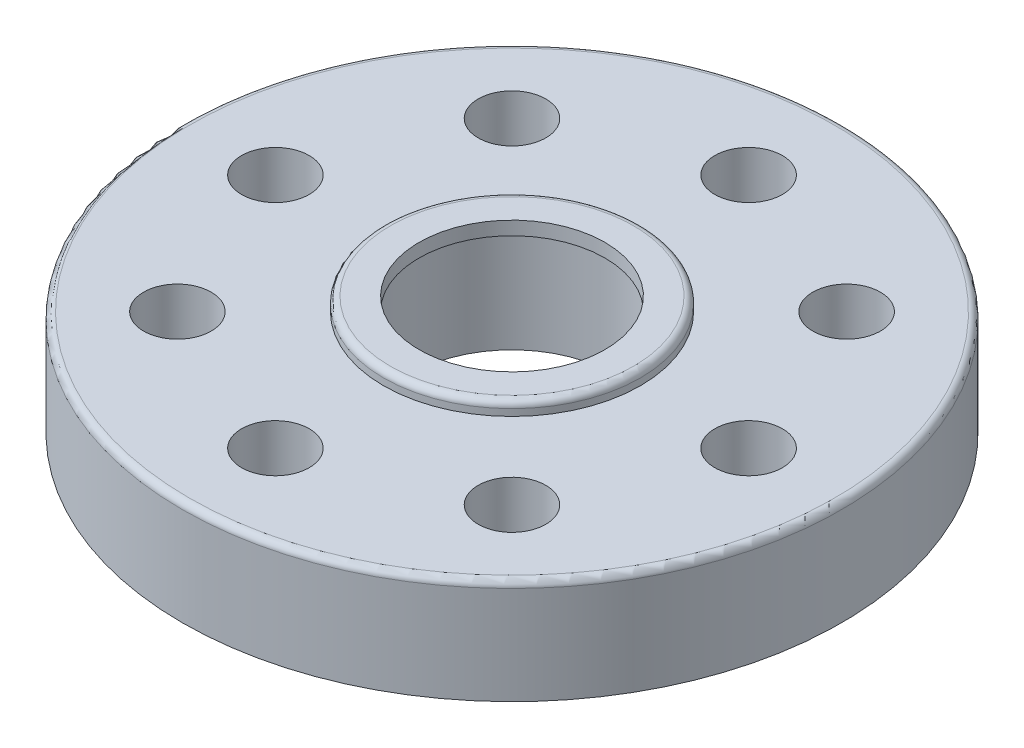
ISO-10303-21;
HEADER;
FILE_DESCRIPTION(('STEP AP214'),'2;1');
FILE_NAME('part.step','',(''),(''),'','','');
FILE_SCHEMA(('AUTOMOTIVE_DESIGN { 1 0 10303 214 1 1 1 1 }'));
ENDSEC;
DATA;
#1=APPLICATION_CONTEXT('core data for automotive mechanical design processes');
#2=APPLICATION_PROTOCOL_DEFINITION('international standard','automotive_design',2000,#1);
#3=PRODUCT_CONTEXT('',#1,'mechanical');
#4=PRODUCT('Part','Part','',(#3));
#5=PRODUCT_RELATED_PRODUCT_CATEGORY('part','',(#4));
#6=PRODUCT_DEFINITION_FORMATION('','',#4);
#7=PRODUCT_DEFINITION_CONTEXT('part definition',#1,'design');
#8=PRODUCT_DEFINITION('design','',#6,#7);
#9=PRODUCT_DEFINITION_SHAPE('','',#8);
#10=(LENGTH_UNIT() NAMED_UNIT(*) SI_UNIT(.MILLI.,.METRE.));
#11=(NAMED_UNIT(*) PLANE_ANGLE_UNIT() SI_UNIT($,.RADIAN.));
#12=(NAMED_UNIT(*) SI_UNIT($,.STERADIAN.) SOLID_ANGLE_UNIT());
#13=UNCERTAINTY_MEASURE_WITH_UNIT(LENGTH_MEASURE(1.E-05),#10,'distance_accuracy_value','');
#14=(GEOMETRIC_REPRESENTATION_CONTEXT(3) GLOBAL_UNCERTAINTY_ASSIGNED_CONTEXT((#13)) GLOBAL_UNIT_ASSIGNED_CONTEXT((#10,
#11,#12)) REPRESENTATION_CONTEXT('',''));
#15=CARTESIAN_POINT('',(0.,0.,0.));
#16=DIRECTION('',(0.,0.,1.));
#17=DIRECTION('',(1.,0.,0.));
#18=AXIS2_PLACEMENT_3D('',#15,#16,#17);
#19=CARTESIAN_POINT('',(0.,3.5,0.));
#20=DIRECTION('',(0.,1.,0.));
#21=DIRECTION('',(0.,0.,1.));
#22=AXIS2_PLACEMENT_3D('',#19,#20,#21);
#23=PLANE('',#22);
#24=CARTESIAN_POINT('',(0.,3.5,0.));
#25=DIRECTION('',(0.,-1.,0.));
#26=DIRECTION('',(0.,0.,-1.));
#27=AXIS2_PLACEMENT_3D('',#24,#25,#26);
#28=CIRCLE('',#27,2.75);
#29=CARTESIAN_POINT('',(0.,3.5,-2.75));
#30=VERTEX_POINT('',#29);
#31=EDGE_CURVE('E18',#30,#30,#28,.T.);
#32=ORIENTED_EDGE('',*,*,#31,.T.);
#33=EDGE_LOOP('',(#32));
#34=FACE_BOUND('',#33,.T.);
#35=CARTESIAN_POINT('',(0.,3.5,0.));
#36=DIRECTION('',(0.,-1.,0.));
#37=DIRECTION('',(0.,0.,1.));
#38=AXIS2_PLACEMENT_3D('',#35,#36,#37);
#39=CIRCLE('',#38,3.6);
#40=CARTESIAN_POINT('',(0.,3.5,3.6));
#41=VERTEX_POINT('',#40);
#42=EDGE_CURVE('E99',#41,#41,#39,.T.);
#43=ORIENTED_EDGE('',*,*,#42,.F.);
#44=EDGE_LOOP('',(#43));
#45=FACE_BOUND('',#44,.T.);
#46=ADVANCED_FACE('F14',(#34,#45),#23,.T.);
#47=CARTESIAN_POINT('',(0.,3.3,0.));
#48=DIRECTION('',(0.,1.,0.));
#49=DIRECTION('',(0.,0.,1.));
#50=AXIS2_PLACEMENT_3D('',#47,#48,#49);
#51=TOROIDAL_SURFACE('',#50,3.6,0.2);
#52=ORIENTED_EDGE('',*,*,#42,.T.);
#53=EDGE_LOOP('',(#52));
#54=FACE_BOUND('',#53,.T.);
#55=CARTESIAN_POINT('',(0.,3.3,0.));
#56=DIRECTION('',(0.,-1.,0.));
#57=DIRECTION('',(0.,0.,-1.));
#58=AXIS2_PLACEMENT_3D('',#55,#56,#57);
#59=CIRCLE('',#58,3.8);
#60=CARTESIAN_POINT('',(0.,3.3,-3.8));
#61=VERTEX_POINT('',#60);
#62=EDGE_CURVE('E90',#61,#61,#59,.T.);
#63=ORIENTED_EDGE('',*,*,#62,.F.);
#64=EDGE_LOOP('',(#63));
#65=FACE_BOUND('',#64,.T.);
#66=ADVANCED_FACE('F133',(#54,#65),#51,.T.);
#67=CARTESIAN_POINT('',(0.,3.5,0.));
#68=DIRECTION('',(0.,-1.,0.));
#69=DIRECTION('',(0.,0.,-1.));
#70=AXIS2_PLACEMENT_3D('',#67,#68,#69);
#71=CYLINDRICAL_SURFACE('',#70,2.75);
#72=CARTESIAN_POINT('',(0.,3.1,0.));
#73=DIRECTION('',(0.,-1.,0.));
#74=DIRECTION('',(0.,0.,-1.));
#75=AXIS2_PLACEMENT_3D('',#72,#73,#74);
#76=CIRCLE('',#75,2.75);
#77=CARTESIAN_POINT('',(0.,3.1,-2.75));
#78=VERTEX_POINT('',#77);
#79=EDGE_CURVE('E88',#78,#78,#76,.T.);
#80=ORIENTED_EDGE('',*,*,#79,.T.);
#81=EDGE_LOOP('',(#80));
#82=FACE_BOUND('',#81,.T.);
#83=ORIENTED_EDGE('',*,*,#31,.F.);
#84=EDGE_LOOP('',(#83));
#85=FACE_BOUND('',#84,.T.);
#86=ADVANCED_FACE('F130',(#82,#85),#71,.F.);
#87=CARTESIAN_POINT('',(0.,3.5,0.));
#88=DIRECTION('',(0.,-1.,0.));
#89=DIRECTION('',(0.,0.,-1.));
#90=AXIS2_PLACEMENT_3D('',#87,#88,#89);
#91=CYLINDRICAL_SURFACE('',#90,3.8);
#92=CARTESIAN_POINT('',(0.,3.1,0.));
#93=DIRECTION('',(0.,-1.,0.));
#94=DIRECTION('',(0.,0.,-1.));
#95=AXIS2_PLACEMENT_3D('',#92,#93,#94);
#96=CIRCLE('',#95,3.8);
#97=CARTESIAN_POINT('',(0.,3.1,-3.8));
#98=VERTEX_POINT('',#97);
#99=EDGE_CURVE('E85',#98,#98,#96,.T.);
#100=ORIENTED_EDGE('',*,*,#99,.F.);
#101=EDGE_LOOP('',(#100));
#102=FACE_BOUND('',#101,.T.);
#103=ORIENTED_EDGE('',*,*,#62,.T.);
#104=EDGE_LOOP('',(#103));
#105=FACE_BOUND('',#104,.T.);
#106=ADVANCED_FACE('F126',(#102,#105),#91,.T.);
#107=CARTESIAN_POINT('',(0.,2.9,0.));
#108=DIRECTION('',(0.,1.,0.));
#109=DIRECTION('',(0.,0.,1.));
#110=AXIS2_PLACEMENT_3D('',#107,#108,#109);
#111=TOROIDAL_SURFACE('',#110,9.55,0.2);
#112=CARTESIAN_POINT('',(0.,3.1,0.));
#113=DIRECTION('',(0.,-1.,0.));
#114=DIRECTION('',(0.,0.,1.));
#115=AXIS2_PLACEMENT_3D('',#112,#113,#114);
#116=CIRCLE('',#115,9.55);
#117=CARTESIAN_POINT('',(0.,3.1,9.55));
#118=VERTEX_POINT('',#117);
#119=EDGE_CURVE('E87',#118,#118,#116,.F.);
#120=ORIENTED_EDGE('',*,*,#119,.F.);
#121=EDGE_LOOP('',(#120));
#122=FACE_BOUND('',#121,.T.);
#123=CARTESIAN_POINT('',(0.,2.9,0.));
#124=DIRECTION('',(0.,-1.,0.));
#125=DIRECTION('',(0.,0.,-1.));
#126=AXIS2_PLACEMENT_3D('',#123,#124,#125);
#127=CIRCLE('',#126,9.75);
#128=CARTESIAN_POINT('',(0.,2.9,-9.75));
#129=VERTEX_POINT('',#128);
#130=EDGE_CURVE('E72',#129,#129,#127,.T.);
#131=ORIENTED_EDGE('',*,*,#130,.F.);
#132=EDGE_LOOP('',(#131));
#133=FACE_BOUND('',#132,.T.);
#134=ADVANCED_FACE('F115',(#122,#133),#111,.T.);
#135=CARTESIAN_POINT('',(0.,3.1,0.));
#136=DIRECTION('',(0.,1.,0.));
#137=DIRECTION('',(0.,0.,1.));
#138=AXIS2_PLACEMENT_3D('',#135,#136,#137);
#139=PLANE('',#138);
#140=ORIENTED_EDGE('',*,*,#79,.F.);
#141=EDGE_LOOP('',(#140));
#142=FACE_BOUND('',#141,.T.);
#143=CARTESIAN_POINT('',(0.,3.1,0.));
#144=DIRECTION('',(0.,-1.,0.));
#145=DIRECTION('',(0.,0.,-1.));
#146=AXIS2_PLACEMENT_3D('',#143,#144,#145);
#147=CIRCLE('',#146,3.);
#148=CARTESIAN_POINT('',(0.,3.1,-3.));
#149=VERTEX_POINT('',#148);
#150=EDGE_CURVE('E69',#149,#149,#147,.T.);
#151=ORIENTED_EDGE('',*,*,#150,.T.);
#152=EDGE_LOOP('',(#151));
#153=FACE_BOUND('',#152,.T.);
#154=ADVANCED_FACE('F125',(#142,#153),#139,.F.);
#155=CARTESIAN_POINT('',(0.,3.1,0.));
#156=DIRECTION('',(0.,1.,0.));
#157=DIRECTION('',(0.,0.,1.));
#158=AXIS2_PLACEMENT_3D('',#155,#156,#157);
#159=PLANE('',#158);
#160=ORIENTED_EDGE('',*,*,#99,.T.);
#161=EDGE_LOOP('',(#160));
#162=FACE_BOUND('',#161,.T.);
#163=CARTESIAN_POINT('',(0.,3.1,-7.));
#164=DIRECTION('',(0.,-1.,0.));
#165=DIRECTION('',(0.,0.,-1.));
#166=AXIS2_PLACEMENT_3D('',#163,#164,#165);
#167=CIRCLE('',#166,1.);
#168=CARTESIAN_POINT('',(0.,3.1,-8.));
#169=VERTEX_POINT('',#168);
#170=EDGE_CURVE('E82',#169,#169,#167,.T.);
#171=ORIENTED_EDGE('',*,*,#170,.T.);
#172=EDGE_LOOP('',(#171));
#173=FACE_BOUND('',#172,.T.);
#174=CARTESIAN_POINT('',(-7.,3.1,0.));
#175=DIRECTION('',(0.,-1.,0.));
#176=DIRECTION('',(0.,0.,-1.));
#177=AXIS2_PLACEMENT_3D('',#174,#175,#176);
#178=CIRCLE('',#177,1.);
#179=CARTESIAN_POINT('',(-7.,3.1,-1.00000000000005));
#180=VERTEX_POINT('',#179);
#181=EDGE_CURVE('E79',#180,#180,#178,.T.);
#182=ORIENTED_EDGE('',*,*,#181,.T.);
#183=EDGE_LOOP('',(#182));
#184=FACE_BOUND('',#183,.T.);
#185=CARTESIAN_POINT('',(0.,3.1,7.));
#186=DIRECTION('',(0.,-1.,0.));
#187=DIRECTION('',(0.,0.,-1.));
#188=AXIS2_PLACEMENT_3D('',#185,#186,#187);
#189=CIRCLE('',#188,1.);
#190=CARTESIAN_POINT('',(0.,3.1,6.));
#191=VERTEX_POINT('',#190);
#192=EDGE_CURVE('E76',#191,#191,#189,.T.);
#193=ORIENTED_EDGE('',*,*,#192,.T.);
#194=EDGE_LOOP('',(#193));
#195=FACE_BOUND('',#194,.T.);
#196=CARTESIAN_POINT('',(7.,3.1,0.));
#197=DIRECTION('',(0.,-1.,0.));
#198=DIRECTION('',(0.,0.,-1.));
#199=AXIS2_PLACEMENT_3D('',#196,#197,#198);
#200=CIRCLE('',#199,1.);
#201=CARTESIAN_POINT('',(7.,3.1,-1.));
#202=VERTEX_POINT('',#201);
#203=EDGE_CURVE('E73',#202,#202,#200,.T.);
#204=ORIENTED_EDGE('',*,*,#203,.T.);
#205=EDGE_LOOP('',(#204));
#206=FACE_BOUND('',#205,.T.);
#207=CARTESIAN_POINT('',(4.94974746830582,3.1,4.94974746830584));
#208=DIRECTION('',(0.,-1.,0.));
#209=DIRECTION('',(0.,0.,-1.));
#210=AXIS2_PLACEMENT_3D('',#207,#208,#209);
#211=CIRCLE('',#210,1.);
#212=CARTESIAN_POINT('',(4.94974746830582,3.1,3.94974746830584));
#213=VERTEX_POINT('',#212);
#214=EDGE_CURVE('E66',#213,#213,#211,.T.);
#215=ORIENTED_EDGE('',*,*,#214,.T.);
#216=EDGE_LOOP('',(#215));
#217=FACE_BOUND('',#216,.T.);
#218=CARTESIAN_POINT('',(-4.94974746830586,3.1,4.94974746830581));
#219=DIRECTION('',(0.,-1.,0.));
#220=DIRECTION('',(0.,0.,-1.));
#221=AXIS2_PLACEMENT_3D('',#218,#219,#220);
#222=CIRCLE('',#221,1.);
#223=CARTESIAN_POINT('',(-4.94974746830586,3.1,3.9497474683058));
#224=VERTEX_POINT('',#223);
#225=EDGE_CURVE('E63',#224,#224,#222,.T.);
#226=ORIENTED_EDGE('',*,*,#225,.T.);
#227=EDGE_LOOP('',(#226));
#228=FACE_BOUND('',#227,.T.);
#229=CARTESIAN_POINT('',(-4.94974746830579,3.1,-4.94974746830588));
#230=DIRECTION('',(0.,-1.,0.));
#231=DIRECTION('',(0.,0.,-1.));
#232=AXIS2_PLACEMENT_3D('',#229,#230,#231);
#233=CIRCLE('',#232,1.);
#234=CARTESIAN_POINT('',(-4.94974746830579,3.1,-5.94974746830588));
#235=VERTEX_POINT('',#234);
#236=EDGE_CURVE('E60',#235,#235,#233,.T.);
#237=ORIENTED_EDGE('',*,*,#236,.T.);
#238=EDGE_LOOP('',(#237));
#239=FACE_BOUND('',#238,.T.);
#240=CARTESIAN_POINT('',(4.94974746830589,3.1,-4.94974746830577));
#241=DIRECTION('',(0.,-1.,0.));
#242=DIRECTION('',(0.,0.,-1.));
#243=AXIS2_PLACEMENT_3D('',#240,#241,#242);
#244=CIRCLE('',#243,1.);
#245=CARTESIAN_POINT('',(4.94974746830589,3.1,-5.94974746830577));
#246=VERTEX_POINT('',#245);
#247=EDGE_CURVE('E57',#246,#246,#244,.T.);
#248=ORIENTED_EDGE('',*,*,#247,.T.);
#249=EDGE_LOOP('',(#248));
#250=FACE_BOUND('',#249,.T.);
#251=ORIENTED_EDGE('',*,*,#119,.T.);
#252=EDGE_LOOP('',(#251));
#253=FACE_BOUND('',#252,.T.);
#254=ADVANCED_FACE('F190',(#162,#173,#184,#195,#206,#217,#228,#239,#250,#253),#159,.T.);
#255=CARTESIAN_POINT('',(0.,3.1,-7.));
#256=DIRECTION('',(0.,-1.,0.));
#257=DIRECTION('',(0.,0.,-1.));
#258=AXIS2_PLACEMENT_3D('',#255,#256,#257);
#259=CYLINDRICAL_SURFACE('',#258,1.);
#260=CARTESIAN_POINT('',(0.,0.,-7.));
#261=DIRECTION('',(0.,-1.,0.));
#262=DIRECTION('',(0.,0.,-1.));
#263=AXIS2_PLACEMENT_3D('',#260,#261,#262);
#264=CIRCLE('',#263,1.);
#265=CARTESIAN_POINT('',(0.,0.,-8.));
#266=VERTEX_POINT('',#265);
#267=EDGE_CURVE('E54',#266,#266,#264,.T.);
#268=ORIENTED_EDGE('',*,*,#267,.T.);
#269=EDGE_LOOP('',(#268));
#270=FACE_BOUND('',#269,.T.);
#271=ORIENTED_EDGE('',*,*,#170,.F.);
#272=EDGE_LOOP('',(#271));
#273=FACE_BOUND('',#272,.T.);
#274=ADVANCED_FACE('F187',(#270,#273),#259,.F.);
#275=CARTESIAN_POINT('',(-7.,3.1,0.));
#276=DIRECTION('',(0.,-1.,0.));
#277=DIRECTION('',(0.,0.,-1.));
#278=AXIS2_PLACEMENT_3D('',#275,#276,#277);
#279=CYLINDRICAL_SURFACE('',#278,1.);
#280=CARTESIAN_POINT('',(-7.,0.,0.));
#281=DIRECTION('',(0.,-1.,0.));
#282=DIRECTION('',(0.,0.,-1.));
#283=AXIS2_PLACEMENT_3D('',#280,#281,#282);
#284=CIRCLE('',#283,1.);
#285=CARTESIAN_POINT('',(-7.,0.,-1.00000000000005));
#286=VERTEX_POINT('',#285);
#287=EDGE_CURVE('E51',#286,#286,#284,.T.);
#288=ORIENTED_EDGE('',*,*,#287,.T.);
#289=EDGE_LOOP('',(#288));
#290=FACE_BOUND('',#289,.T.);
#291=ORIENTED_EDGE('',*,*,#181,.F.);
#292=EDGE_LOOP('',(#291));
#293=FACE_BOUND('',#292,.T.);
#294=ADVANCED_FACE('F183',(#290,#293),#279,.F.);
#295=CARTESIAN_POINT('',(0.,3.1,7.));
#296=DIRECTION('',(0.,-1.,0.));
#297=DIRECTION('',(0.,0.,-1.));
#298=AXIS2_PLACEMENT_3D('',#295,#296,#297);
#299=CYLINDRICAL_SURFACE('',#298,1.);
#300=CARTESIAN_POINT('',(0.,0.,7.));
#301=DIRECTION('',(0.,-1.,0.));
#302=DIRECTION('',(0.,0.,-1.));
#303=AXIS2_PLACEMENT_3D('',#300,#301,#302);
#304=CIRCLE('',#303,1.);
#305=CARTESIAN_POINT('',(0.,0.,6.));
#306=VERTEX_POINT('',#305);
#307=EDGE_CURVE('E48',#306,#306,#304,.T.);
#308=ORIENTED_EDGE('',*,*,#307,.T.);
#309=EDGE_LOOP('',(#308));
#310=FACE_BOUND('',#309,.T.);
#311=ORIENTED_EDGE('',*,*,#192,.F.);
#312=EDGE_LOOP('',(#311));
#313=FACE_BOUND('',#312,.T.);
#314=ADVANCED_FACE('F179',(#310,#313),#299,.F.);
#315=CARTESIAN_POINT('',(7.,3.1,0.));
#316=DIRECTION('',(0.,-1.,0.));
#317=DIRECTION('',(0.,0.,-1.));
#318=AXIS2_PLACEMENT_3D('',#315,#316,#317);
#319=CYLINDRICAL_SURFACE('',#318,1.);
#320=CARTESIAN_POINT('',(7.,0.,0.));
#321=DIRECTION('',(0.,-1.,0.));
#322=DIRECTION('',(0.,0.,-1.));
#323=AXIS2_PLACEMENT_3D('',#320,#321,#322);
#324=CIRCLE('',#323,1.);
#325=CARTESIAN_POINT('',(7.,0.,-1.));
#326=VERTEX_POINT('',#325);
#327=EDGE_CURVE('E45',#326,#326,#324,.T.);
#328=ORIENTED_EDGE('',*,*,#327,.T.);
#329=EDGE_LOOP('',(#328));
#330=FACE_BOUND('',#329,.T.);
#331=ORIENTED_EDGE('',*,*,#203,.F.);
#332=EDGE_LOOP('',(#331));
#333=FACE_BOUND('',#332,.T.);
#334=ADVANCED_FACE('F175',(#330,#333),#319,.F.);
#335=CARTESIAN_POINT('',(0.,3.1,0.));
#336=DIRECTION('',(0.,-1.,0.));
#337=DIRECTION('',(0.,0.,-1.));
#338=AXIS2_PLACEMENT_3D('',#335,#336,#337);
#339=CYLINDRICAL_SURFACE('',#338,9.75);
#340=CARTESIAN_POINT('',(0.,0.,0.));
#341=DIRECTION('',(0.,-1.,0.));
#342=DIRECTION('',(0.,0.,-1.));
#343=AXIS2_PLACEMENT_3D('',#340,#341,#342);
#344=CIRCLE('',#343,9.75);
#345=CARTESIAN_POINT('',(0.,0.,-9.75));
#346=VERTEX_POINT('',#345);
#347=EDGE_CURVE('E42',#346,#346,#344,.F.);
#348=ORIENTED_EDGE('',*,*,#347,.T.);
#349=EDGE_LOOP('',(#348));
#350=FACE_BOUND('',#349,.T.);
#351=ORIENTED_EDGE('',*,*,#130,.T.);
#352=EDGE_LOOP('',(#351));
#353=FACE_BOUND('',#352,.T.);
#354=ADVANCED_FACE('F171',(#350,#353),#339,.T.);
#355=CARTESIAN_POINT('',(0.,3.1,0.));
#356=DIRECTION('',(0.,-1.,0.));
#357=DIRECTION('',(0.,0.,-1.));
#358=AXIS2_PLACEMENT_3D('',#355,#356,#357);
#359=CYLINDRICAL_SURFACE('',#358,3.);
#360=CARTESIAN_POINT('',(0.,0.,0.));
#361=DIRECTION('',(0.,-1.,0.));
#362=DIRECTION('',(0.,0.,-1.));
#363=AXIS2_PLACEMENT_3D('',#360,#361,#362);
#364=CIRCLE('',#363,3.);
#365=CARTESIAN_POINT('',(0.,0.,-3.));
#366=VERTEX_POINT('',#365);
#367=EDGE_CURVE('E39',#366,#366,#364,.T.);
#368=ORIENTED_EDGE('',*,*,#367,.T.);
#369=EDGE_LOOP('',(#368));
#370=FACE_BOUND('',#369,.T.);
#371=ORIENTED_EDGE('',*,*,#150,.F.);
#372=EDGE_LOOP('',(#371));
#373=FACE_BOUND('',#372,.T.);
#374=ADVANCED_FACE('F167',(#370,#373),#359,.F.);
#375=CARTESIAN_POINT('',(4.94974746830582,3.1,4.94974746830584));
#376=DIRECTION('',(0.,-1.,0.));
#377=DIRECTION('',(0.,0.,-1.));
#378=AXIS2_PLACEMENT_3D('',#375,#376,#377);
#379=CYLINDRICAL_SURFACE('',#378,1.);
#380=CARTESIAN_POINT('',(4.94974746830582,0.,4.94974746830584));
#381=DIRECTION('',(0.,-1.,0.));
#382=DIRECTION('',(0.,0.,-1.));
#383=AXIS2_PLACEMENT_3D('',#380,#381,#382);
#384=CIRCLE('',#383,1.);
#385=CARTESIAN_POINT('',(4.94974746830582,0.,3.94974746830584));
#386=VERTEX_POINT('',#385);
#387=EDGE_CURVE('E36',#386,#386,#384,.T.);
#388=ORIENTED_EDGE('',*,*,#387,.T.);
#389=EDGE_LOOP('',(#388));
#390=FACE_BOUND('',#389,.T.);
#391=ORIENTED_EDGE('',*,*,#214,.F.);
#392=EDGE_LOOP('',(#391));
#393=FACE_BOUND('',#392,.T.);
#394=ADVANCED_FACE('F163',(#390,#393),#379,.F.);
#395=CARTESIAN_POINT('',(-4.94974746830586,3.1,4.94974746830581));
#396=DIRECTION('',(0.,-1.,0.));
#397=DIRECTION('',(0.,0.,-1.));
#398=AXIS2_PLACEMENT_3D('',#395,#396,#397);
#399=CYLINDRICAL_SURFACE('',#398,1.);
#400=CARTESIAN_POINT('',(-4.94974746830586,0.,4.94974746830581));
#401=DIRECTION('',(0.,-1.,0.));
#402=DIRECTION('',(0.,0.,-1.));
#403=AXIS2_PLACEMENT_3D('',#400,#401,#402);
#404=CIRCLE('',#403,1.);
#405=CARTESIAN_POINT('',(-4.94974746830586,0.,3.9497474683058));
#406=VERTEX_POINT('',#405);
#407=EDGE_CURVE('E27',#406,#406,#404,.T.);
#408=ORIENTED_EDGE('',*,*,#407,.T.);
#409=EDGE_LOOP('',(#408));
#410=FACE_BOUND('',#409,.T.);
#411=ORIENTED_EDGE('',*,*,#225,.F.);
#412=EDGE_LOOP('',(#411));
#413=FACE_BOUND('',#412,.T.);
#414=ADVANCED_FACE('F159',(#410,#413),#399,.F.);
#415=CARTESIAN_POINT('',(-4.94974746830579,3.1,-4.94974746830588));
#416=DIRECTION('',(0.,-1.,0.));
#417=DIRECTION('',(0.,0.,-1.));
#418=AXIS2_PLACEMENT_3D('',#415,#416,#417);
#419=CYLINDRICAL_SURFACE('',#418,1.);
#420=CARTESIAN_POINT('',(-4.94974746830579,0.,-4.94974746830588));
#421=DIRECTION('',(0.,-1.,0.));
#422=DIRECTION('',(0.,0.,-1.));
#423=AXIS2_PLACEMENT_3D('',#420,#421,#422);
#424=CIRCLE('',#423,1.);
#425=CARTESIAN_POINT('',(-4.94974746830579,0.,-5.94974746830588));
#426=VERTEX_POINT('',#425);
#427=EDGE_CURVE('E22',#426,#426,#424,.T.);
#428=ORIENTED_EDGE('',*,*,#427,.T.);
#429=EDGE_LOOP('',(#428));
#430=FACE_BOUND('',#429,.T.);
#431=ORIENTED_EDGE('',*,*,#236,.F.);
#432=EDGE_LOOP('',(#431));
#433=FACE_BOUND('',#432,.T.);
#434=ADVANCED_FACE('F153',(#430,#433),#419,.F.);
#435=CARTESIAN_POINT('',(4.94974746830589,3.1,-4.94974746830577));
#436=DIRECTION('',(0.,-1.,0.));
#437=DIRECTION('',(0.,0.,-1.));
#438=AXIS2_PLACEMENT_3D('',#435,#436,#437);
#439=CYLINDRICAL_SURFACE('',#438,1.);
#440=CARTESIAN_POINT('',(4.94974746830589,0.,-4.94974746830577));
#441=DIRECTION('',(0.,-1.,0.));
#442=DIRECTION('',(0.,0.,-1.));
#443=AXIS2_PLACEMENT_3D('',#440,#441,#442);
#444=CIRCLE('',#443,1.);
#445=CARTESIAN_POINT('',(4.94974746830589,0.,-5.94974746830577));
#446=VERTEX_POINT('',#445);
#447=EDGE_CURVE('E10',#446,#446,#444,.T.);
#448=ORIENTED_EDGE('',*,*,#447,.T.);
#449=EDGE_LOOP('',(#448));
#450=FACE_BOUND('',#449,.T.);
#451=ORIENTED_EDGE('',*,*,#247,.F.);
#452=EDGE_LOOP('',(#451));
#453=FACE_BOUND('',#452,.T.);
#454=ADVANCED_FACE('F147',(#450,#453),#439,.F.);
#455=CARTESIAN_POINT('',(0.,0.,0.));
#456=DIRECTION('',(0.,1.,0.));
#457=DIRECTION('',(0.,0.,1.));
#458=AXIS2_PLACEMENT_3D('',#455,#456,#457);
#459=PLANE('',#458);
#460=ORIENTED_EDGE('',*,*,#447,.F.);
#461=EDGE_LOOP('',(#460));
#462=FACE_BOUND('',#461,.T.);
#463=ORIENTED_EDGE('',*,*,#427,.F.);
#464=EDGE_LOOP('',(#463));
#465=FACE_BOUND('',#464,.T.);
#466=ORIENTED_EDGE('',*,*,#407,.F.);
#467=EDGE_LOOP('',(#466));
#468=FACE_BOUND('',#467,.T.);
#469=ORIENTED_EDGE('',*,*,#387,.F.);
#470=EDGE_LOOP('',(#469));
#471=FACE_BOUND('',#470,.T.);
#472=ORIENTED_EDGE('',*,*,#367,.F.);
#473=EDGE_LOOP('',(#472));
#474=FACE_BOUND('',#473,.T.);
#475=ORIENTED_EDGE('',*,*,#347,.F.);
#476=EDGE_LOOP('',(#475));
#477=FACE_BOUND('',#476,.T.);
#478=ORIENTED_EDGE('',*,*,#327,.F.);
#479=EDGE_LOOP('',(#478));
#480=FACE_BOUND('',#479,.T.);
#481=ORIENTED_EDGE('',*,*,#307,.F.);
#482=EDGE_LOOP('',(#481));
#483=FACE_BOUND('',#482,.T.);
#484=ORIENTED_EDGE('',*,*,#287,.F.);
#485=EDGE_LOOP('',(#484));
#486=FACE_BOUND('',#485,.T.);
#487=ORIENTED_EDGE('',*,*,#267,.F.);
#488=EDGE_LOOP('',(#487));
#489=FACE_BOUND('',#488,.T.);
#490=ADVANCED_FACE('F145',(#462,#465,#468,#471,#474,#477,#480,#483,#486,#489),#459,.F.);
#491=CLOSED_SHELL('',(#46,#66,#86,#106,#134,#154,#254,#274,#294,#314,#334,#354,#374,#394,#414,
#434,#454,#490));
#492=MANIFOLD_SOLID_BREP('B1',#491);
#493=ADVANCED_BREP_SHAPE_REPRESENTATION('',(#18,#492),#14);
#494=SHAPE_DEFINITION_REPRESENTATION(#9,#493);
ENDSEC;
END-ISO-10303-21;
